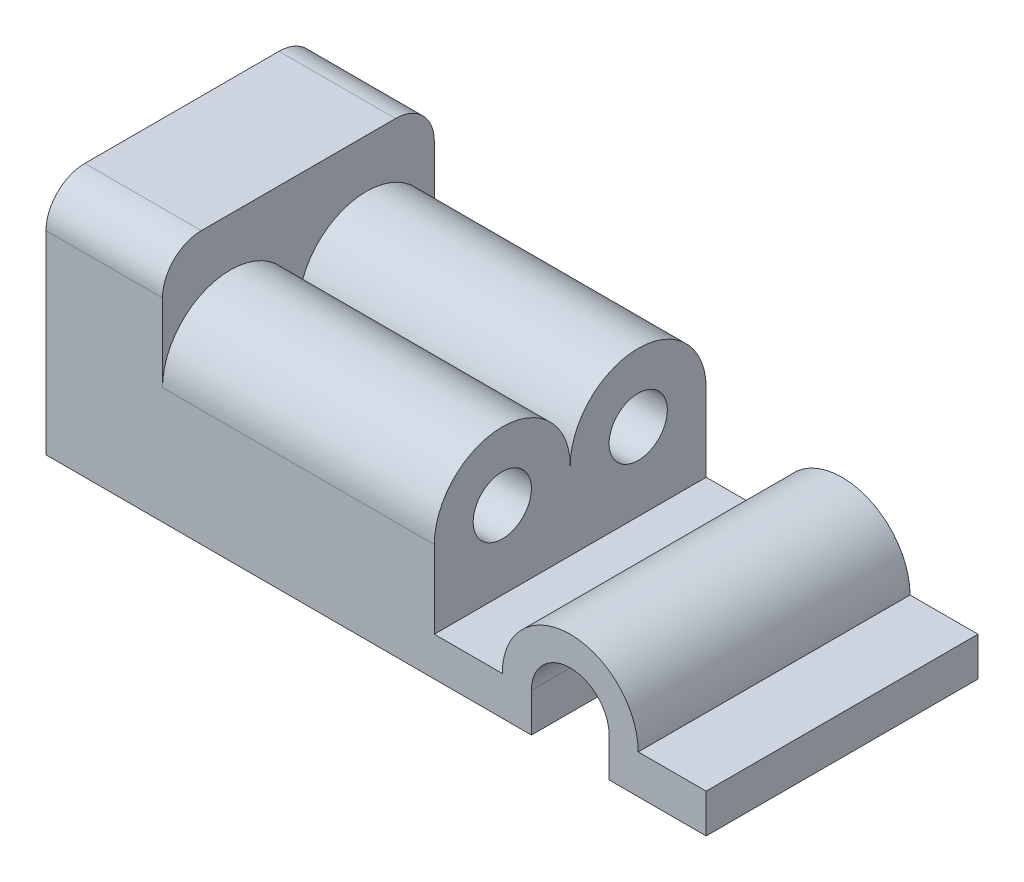
ISO-10303-21;
HEADER;
FILE_DESCRIPTION(('STEP AP214'),'2;1');
FILE_NAME('part.step','',(''),(''),'','','');
FILE_SCHEMA(('AUTOMOTIVE_DESIGN { 1 0 10303 214 1 1 1 1 }'));
ENDSEC;
DATA;
#1=APPLICATION_CONTEXT('core data for automotive mechanical design processes');
#2=APPLICATION_PROTOCOL_DEFINITION('international standard','automotive_design',2000,#1);
#3=PRODUCT_CONTEXT('',#1,'mechanical');
#4=PRODUCT('Part','Part','',(#3));
#5=PRODUCT_RELATED_PRODUCT_CATEGORY('part','',(#4));
#6=PRODUCT_DEFINITION_FORMATION('','',#4);
#7=PRODUCT_DEFINITION_CONTEXT('part definition',#1,'design');
#8=PRODUCT_DEFINITION('design','',#6,#7);
#9=PRODUCT_DEFINITION_SHAPE('','',#8);
#10=(LENGTH_UNIT() NAMED_UNIT(*) SI_UNIT(.MILLI.,.METRE.));
#11=(NAMED_UNIT(*) PLANE_ANGLE_UNIT() SI_UNIT($,.RADIAN.));
#12=(NAMED_UNIT(*) SI_UNIT($,.STERADIAN.) SOLID_ANGLE_UNIT());
#13=UNCERTAINTY_MEASURE_WITH_UNIT(LENGTH_MEASURE(1.E-05),#10,'distance_accuracy_value','');
#14=(GEOMETRIC_REPRESENTATION_CONTEXT(3) GLOBAL_UNCERTAINTY_ASSIGNED_CONTEXT((#13)) GLOBAL_UNIT_ASSIGNED_CONTEXT((#10,
#11,#12)) REPRESENTATION_CONTEXT('',''));
#15=CARTESIAN_POINT('',(0.,0.,0.));
#16=DIRECTION('',(0.,0.,1.));
#17=DIRECTION('',(1.,0.,0.));
#18=AXIS2_PLACEMENT_3D('',#15,#16,#17);
#19=CARTESIAN_POINT('',(60.,-30.,-70.));
#20=DIRECTION('',(0.,-1.,0.));
#21=DIRECTION('',(1.,0.,0.));
#22=AXIS2_PLACEMENT_3D('',#19,#20,#21);
#23=PLANE('',#22);
#24=DIRECTION('',(1.,0.,0.));
#25=VECTOR('',#24,1.);
#26=CARTESIAN_POINT('',(60.,-30.,0.));
#27=LINE('',#26,#25);
#28=CARTESIAN_POINT('',(60.,-30.,0.));
#29=VERTEX_POINT('',#28);
#30=CARTESIAN_POINT('',(85.,-30.,0.));
#31=VERTEX_POINT('',#30);
#32=EDGE_CURVE('E183',#29,#31,#27,.T.);
#33=ORIENTED_EDGE('',*,*,#32,.F.);
#34=DIRECTION('',(0.,0.,1.));
#35=VECTOR('',#34,1.);
#36=CARTESIAN_POINT('',(60.,-30.,-70.));
#37=LINE('',#36,#35);
#38=CARTESIAN_POINT('',(60.,-30.,-70.));
#39=VERTEX_POINT('',#38);
#40=EDGE_CURVE('E294',#39,#29,#37,.T.);
#41=ORIENTED_EDGE('',*,*,#40,.F.);
#42=DIRECTION('',(1.,0.,0.));
#43=VECTOR('',#42,1.);
#44=CARTESIAN_POINT('',(60.,-30.,-70.));
#45=LINE('',#44,#43);
#46=CARTESIAN_POINT('',(85.,-30.,-70.));
#47=VERTEX_POINT('',#46);
#48=EDGE_CURVE('E199',#39,#47,#45,.T.);
#49=ORIENTED_EDGE('',*,*,#48,.T.);
#50=DIRECTION('',(0.,0.,1.));
#51=VECTOR('',#50,1.);
#52=CARTESIAN_POINT('',(85.,-30.,-70.));
#53=LINE('',#52,#51);
#54=EDGE_CURVE('E247',#47,#31,#53,.T.);
#55=ORIENTED_EDGE('',*,*,#54,.T.);
#56=EDGE_LOOP('',(#33,#41,#49,#55));
#57=FACE_BOUND('',#56,.T.);
#58=ADVANCED_FACE('F43',(#57),#23,.T.);
#59=CARTESIAN_POINT('',(60.,-20.,-70.));
#60=DIRECTION('',(-1.,0.,0.));
#61=DIRECTION('',(0.,0.,1.));
#62=AXIS2_PLACEMENT_3D('',#59,#60,#61);
#63=PLANE('',#62);
#64=DIRECTION('',(0.,-1.,0.));
#65=VECTOR('',#64,1.);
#66=CARTESIAN_POINT('',(60.,-20.,0.));
#67=LINE('',#66,#65);
#68=CARTESIAN_POINT('',(60.,-20.,0.));
#69=VERTEX_POINT('',#68);
#70=EDGE_CURVE('E204',#69,#29,#67,.T.);
#71=ORIENTED_EDGE('',*,*,#70,.F.);
#72=DIRECTION('',(0.,0.,1.));
#73=VECTOR('',#72,1.);
#74=CARTESIAN_POINT('',(60.,-20.,-70.));
#75=LINE('',#74,#73);
#76=CARTESIAN_POINT('',(60.,-20.,-70.));
#77=VERTEX_POINT('',#76);
#78=EDGE_CURVE('E298',#77,#69,#75,.T.);
#79=ORIENTED_EDGE('',*,*,#78,.F.);
#80=DIRECTION('',(0.,-1.,0.));
#81=VECTOR('',#80,1.);
#82=CARTESIAN_POINT('',(60.,-20.,-70.));
#83=LINE('',#82,#81);
#84=EDGE_CURVE('E243',#77,#39,#83,.T.);
#85=ORIENTED_EDGE('',*,*,#84,.T.);
#86=ORIENTED_EDGE('',*,*,#40,.T.);
#87=EDGE_LOOP('',(#71,#79,#85,#86));
#88=FACE_BOUND('',#87,.T.);
#89=ADVANCED_FACE('F392',(#88),#63,.T.);
#90=CARTESIAN_POINT('',(50.,-20.,-70.));
#91=DIRECTION('',(0.,0.,1.));
#92=DIRECTION('',(1.,0.,0.));
#93=AXIS2_PLACEMENT_3D('',#90,#91,#92);
#94=CYLINDRICAL_SURFACE('',#93,10.);
#95=CARTESIAN_POINT('',(50.,-20.,0.));
#96=DIRECTION('',(0.,0.,-1.));
#97=DIRECTION('',(1.,0.,0.));
#98=AXIS2_PLACEMENT_3D('',#95,#96,#97);
#99=CIRCLE('',#98,10.);
#100=CARTESIAN_POINT('',(40.,-20.,0.));
#101=VERTEX_POINT('',#100);
#102=EDGE_CURVE('E287',#101,#69,#99,.T.);
#103=ORIENTED_EDGE('',*,*,#102,.F.);
#104=DIRECTION('',(0.,0.,1.));
#105=VECTOR('',#104,1.);
#106=CARTESIAN_POINT('',(40.,-20.,-70.));
#107=LINE('',#106,#105);
#108=CARTESIAN_POINT('',(40.,-20.,-70.));
#109=VERTEX_POINT('',#108);
#110=EDGE_CURVE('E301',#109,#101,#107,.T.);
#111=ORIENTED_EDGE('',*,*,#110,.F.);
#112=CARTESIAN_POINT('',(50.,-20.,-70.));
#113=DIRECTION('',(0.,0.,-1.));
#114=DIRECTION('',(1.,0.,0.));
#115=AXIS2_PLACEMENT_3D('',#112,#113,#114);
#116=CIRCLE('',#115,10.);
#117=EDGE_CURVE('E239',#109,#77,#116,.T.);
#118=ORIENTED_EDGE('',*,*,#117,.T.);
#119=ORIENTED_EDGE('',*,*,#78,.T.);
#120=EDGE_LOOP('',(#103,#111,#118,#119));
#121=FACE_BOUND('',#120,.T.);
#122=ADVANCED_FACE('F416',(#121),#94,.F.);
#123=CARTESIAN_POINT('',(40.,-20.,-70.));
#124=DIRECTION('',(1.,0.,0.));
#125=DIRECTION('',(0.,1.,0.));
#126=AXIS2_PLACEMENT_3D('',#123,#124,#125);
#127=PLANE('',#126);
#128=DIRECTION('',(0.,1.,0.));
#129=VECTOR('',#128,1.);
#130=CARTESIAN_POINT('',(40.,-20.,0.));
#131=LINE('',#130,#129);
#132=CARTESIAN_POINT('',(40.,-30.,0.));
#133=VERTEX_POINT('',#132);
#134=EDGE_CURVE('E283',#133,#101,#131,.T.);
#135=ORIENTED_EDGE('',*,*,#134,.F.);
#136=DIRECTION('',(0.,0.,1.));
#137=VECTOR('',#136,1.);
#138=CARTESIAN_POINT('',(40.,-30.,-70.));
#139=LINE('',#138,#137);
#140=CARTESIAN_POINT('',(40.,-30.,-70.));
#141=VERTEX_POINT('',#140);
#142=EDGE_CURVE('E304',#141,#133,#139,.T.);
#143=ORIENTED_EDGE('',*,*,#142,.F.);
#144=DIRECTION('',(0.,1.,0.));
#145=VECTOR('',#144,1.);
#146=CARTESIAN_POINT('',(40.,-20.,-70.));
#147=LINE('',#146,#145);
#148=EDGE_CURVE('E235',#141,#109,#147,.T.);
#149=ORIENTED_EDGE('',*,*,#148,.T.);
#150=ORIENTED_EDGE('',*,*,#110,.T.);
#151=EDGE_LOOP('',(#135,#143,#149,#150));
#152=FACE_BOUND('',#151,.T.);
#153=ADVANCED_FACE('F399',(#152),#127,.T.);
#154=CARTESIAN_POINT('',(-85.,-30.,-70.));
#155=DIRECTION('',(0.,-1.,0.));
#156=DIRECTION('',(1.,0.,0.));
#157=AXIS2_PLACEMENT_3D('',#154,#155,#156);
#158=PLANE('',#157);
#159=DIRECTION('',(1.,0.,0.));
#160=VECTOR('',#159,1.);
#161=CARTESIAN_POINT('',(-85.,-30.,0.));
#162=LINE('',#161,#160);
#163=CARTESIAN_POINT('',(-85.,-30.,0.));
#164=VERTEX_POINT('',#163);
#165=EDGE_CURVE('E279',#164,#133,#162,.T.);
#166=ORIENTED_EDGE('',*,*,#165,.F.);
#167=DIRECTION('',(0.,0.,1.));
#168=VECTOR('',#167,1.);
#169=CARTESIAN_POINT('',(-85.,-30.,-70.));
#170=LINE('',#169,#168);
#171=CARTESIAN_POINT('',(-85.,-30.,-70.));
#172=VERTEX_POINT('',#171);
#173=EDGE_CURVE('E307',#172,#164,#170,.T.);
#174=ORIENTED_EDGE('',*,*,#173,.F.);
#175=DIRECTION('',(1.,0.,0.));
#176=VECTOR('',#175,1.);
#177=CARTESIAN_POINT('',(-85.,-30.,-70.));
#178=LINE('',#177,#176);
#179=EDGE_CURVE('E231',#172,#141,#178,.T.);
#180=ORIENTED_EDGE('',*,*,#179,.T.);
#181=ORIENTED_EDGE('',*,*,#142,.T.);
#182=EDGE_LOOP('',(#166,#174,#180,#181));
#183=FACE_BOUND('',#182,.T.);
#184=ADVANCED_FACE('F403',(#183),#158,.T.);
#185=CARTESIAN_POINT('',(-85.,30.,-70.));
#186=DIRECTION('',(-1.,0.,0.));
#187=DIRECTION('',(0.,0.,1.));
#188=AXIS2_PLACEMENT_3D('',#185,#186,#187);
#189=PLANE('',#188);
#190=CARTESIAN_POINT('',(-85.,0.,-17.5));
#191=DIRECTION('',(-1.,0.,0.));
#192=DIRECTION('',(0.,0.,1.));
#193=AXIS2_PLACEMENT_3D('',#190,#191,#192);
#194=CIRCLE('',#193,7.5);
#195=CARTESIAN_POINT('',(-85.,7.49999999999999,-17.5));
#196=VERTEX_POINT('',#195);
#197=EDGE_CURVE('E192',#196,#196,#194,.T.);
#198=ORIENTED_EDGE('',*,*,#197,.F.);
#199=EDGE_LOOP('',(#198));
#200=FACE_BOUND('',#199,.T.);
#201=CARTESIAN_POINT('',(-85.,0.,-52.5));
#202=DIRECTION('',(-1.,0.,0.));
#203=DIRECTION('',(0.,0.,1.));
#204=AXIS2_PLACEMENT_3D('',#201,#202,#203);
#205=CIRCLE('',#204,7.5);
#206=CARTESIAN_POINT('',(-85.,7.49999999999999,-52.5));
#207=VERTEX_POINT('',#206);
#208=EDGE_CURVE('E465',#207,#207,#205,.T.);
#209=ORIENTED_EDGE('',*,*,#208,.F.);
#210=EDGE_LOOP('',(#209));
#211=FACE_BOUND('',#210,.T.);
#212=DIRECTION('',(0.,0.,1.));
#213=VECTOR('',#212,1.);
#214=CARTESIAN_POINT('',(-85.,30.,-70.));
#215=LINE('',#214,#213);
#216=CARTESIAN_POINT('',(-85.,30.,-60.));
#217=VERTEX_POINT('',#216);
#218=CARTESIAN_POINT('',(-85.,30.,-10.));
#219=VERTEX_POINT('',#218);
#220=EDGE_CURVE('E311',#217,#219,#215,.T.);
#221=ORIENTED_EDGE('',*,*,#220,.F.);
#222=CARTESIAN_POINT('',(-85.,20.,-60.));
#223=DIRECTION('',(-1.,0.,0.));
#224=DIRECTION('',(0.,0.,1.));
#225=AXIS2_PLACEMENT_3D('',#222,#223,#224);
#226=CIRCLE('',#225,10.);
#227=CARTESIAN_POINT('',(-85.,20.,-70.));
#228=VERTEX_POINT('',#227);
#229=EDGE_CURVE('E66',#217,#228,#226,.T.);
#230=ORIENTED_EDGE('',*,*,#229,.T.);
#231=DIRECTION('',(0.,-1.,0.));
#232=VECTOR('',#231,1.);
#233=CARTESIAN_POINT('',(-85.,30.,-70.));
#234=LINE('',#233,#232);
#235=EDGE_CURVE('E228',#228,#172,#234,.T.);
#236=ORIENTED_EDGE('',*,*,#235,.T.);
#237=ORIENTED_EDGE('',*,*,#173,.T.);
#238=DIRECTION('',(0.,-1.,0.));
#239=VECTOR('',#238,1.);
#240=CARTESIAN_POINT('',(-85.,30.,0.));
#241=LINE('',#240,#239);
#242=CARTESIAN_POINT('',(-85.,20.,0.));
#243=VERTEX_POINT('',#242);
#244=EDGE_CURVE('E276',#243,#164,#241,.T.);
#245=ORIENTED_EDGE('',*,*,#244,.F.);
#246=CARTESIAN_POINT('',(-85.,20.,-10.));
#247=DIRECTION('',(-1.,0.,0.));
#248=DIRECTION('',(0.,0.,1.));
#249=AXIS2_PLACEMENT_3D('',#246,#247,#248);
#250=CIRCLE('',#249,10.);
#251=EDGE_CURVE('E334',#243,#219,#250,.T.);
#252=ORIENTED_EDGE('',*,*,#251,.T.);
#253=EDGE_LOOP('',(#221,#230,#236,#237,#245,#252));
#254=FACE_BOUND('',#253,.T.);
#255=ADVANCED_FACE('F357',(#200,#211,#254),#189,.T.);
#256=CARTESIAN_POINT('',(-85.,30.,-70.));
#257=DIRECTION('',(0.,1.,0.));
#258=DIRECTION('',(0.,0.,1.));
#259=AXIS2_PLACEMENT_3D('',#256,#257,#258);
#260=PLANE('',#259);
#261=DIRECTION('',(0.,0.,1.));
#262=VECTOR('',#261,1.);
#263=CARTESIAN_POINT('',(-55.,30.,-70.));
#264=LINE('',#263,#262);
#265=CARTESIAN_POINT('',(-55.,30.,-60.));
#266=VERTEX_POINT('',#265);
#267=CARTESIAN_POINT('',(-55.,30.,-10.));
#268=VERTEX_POINT('',#267);
#269=EDGE_CURVE('E314',#266,#268,#264,.T.);
#270=ORIENTED_EDGE('',*,*,#269,.F.);
#271=DIRECTION('',(-1.,0.,0.));
#272=VECTOR('',#271,1.);
#273=CARTESIAN_POINT('',(-85.,30.,-60.));
#274=LINE('',#273,#272);
#275=EDGE_CURVE('E345',#266,#217,#274,.T.);
#276=ORIENTED_EDGE('',*,*,#275,.T.);
#277=ORIENTED_EDGE('',*,*,#220,.T.);
#278=DIRECTION('',(-1.,0.,0.));
#279=VECTOR('',#278,1.);
#280=CARTESIAN_POINT('',(-85.,30.,-10.));
#281=LINE('',#280,#279);
#282=EDGE_CURVE('E338',#219,#268,#281,.F.);
#283=ORIENTED_EDGE('',*,*,#282,.T.);
#284=EDGE_LOOP('',(#270,#276,#277,#283));
#285=FACE_BOUND('',#284,.T.);
#286=ADVANCED_FACE('F354',(#285),#260,.T.);
#287=CARTESIAN_POINT('',(-55.,30.,-70.));
#288=DIRECTION('',(1.,0.,0.));
#289=DIRECTION('',(0.,0.,-1.));
#290=AXIS2_PLACEMENT_3D('',#287,#288,#289);
#291=PLANE('',#290);
#292=CARTESIAN_POINT('',(-55.,0.,-52.5));
#293=DIRECTION('',(1.,0.,0.));
#294=DIRECTION('',(0.,1.,0.));
#295=AXIS2_PLACEMENT_3D('',#292,#293,#294);
#296=CIRCLE('',#295,17.5);
#297=CARTESIAN_POINT('',(-55.,0.,-70.));
#298=VERTEX_POINT('',#297);
#299=CARTESIAN_POINT('',(-55.,0.,-35.));
#300=VERTEX_POINT('',#299);
#301=EDGE_CURVE('E181',#298,#300,#296,.T.);
#302=ORIENTED_EDGE('',*,*,#301,.F.);
#303=DIRECTION('',(0.,1.,0.));
#304=VECTOR('',#303,1.);
#305=CARTESIAN_POINT('',(-55.,30.,-70.));
#306=LINE('',#305,#304);
#307=CARTESIAN_POINT('',(-55.,20.,-70.));
#308=VERTEX_POINT('',#307);
#309=EDGE_CURVE('E225',#298,#308,#306,.T.);
#310=ORIENTED_EDGE('',*,*,#309,.T.);
#311=CARTESIAN_POINT('',(-55.,20.,-60.));
#312=DIRECTION('',(1.,0.,0.));
#313=DIRECTION('',(0.,0.,-1.));
#314=AXIS2_PLACEMENT_3D('',#311,#312,#313);
#315=CIRCLE('',#314,10.);
#316=EDGE_CURVE('E11',#308,#266,#315,.T.);
#317=ORIENTED_EDGE('',*,*,#316,.T.);
#318=ORIENTED_EDGE('',*,*,#269,.T.);
#319=CARTESIAN_POINT('',(-55.,20.,-10.));
#320=DIRECTION('',(1.,0.,0.));
#321=DIRECTION('',(0.,0.,-1.));
#322=AXIS2_PLACEMENT_3D('',#319,#320,#321);
#323=CIRCLE('',#322,10.);
#324=CARTESIAN_POINT('',(-55.,20.,0.));
#325=VERTEX_POINT('',#324);
#326=EDGE_CURVE('E342',#268,#325,#323,.T.);
#327=ORIENTED_EDGE('',*,*,#326,.T.);
#328=DIRECTION('',(0.,1.,0.));
#329=VECTOR('',#328,1.);
#330=CARTESIAN_POINT('',(-55.,30.,0.));
#331=LINE('',#330,#329);
#332=CARTESIAN_POINT('',(-55.,0.,0.));
#333=VERTEX_POINT('',#332);
#334=EDGE_CURVE('E272',#333,#325,#331,.T.);
#335=ORIENTED_EDGE('',*,*,#334,.F.);
#336=CARTESIAN_POINT('',(-55.,0.,-17.5));
#337=DIRECTION('',(1.,0.,0.));
#338=DIRECTION('',(0.,1.,0.));
#339=AXIS2_PLACEMENT_3D('',#336,#337,#338);
#340=CIRCLE('',#339,17.5);
#341=EDGE_CURVE('E173',#300,#333,#340,.T.);
#342=ORIENTED_EDGE('',*,*,#341,.F.);
#343=EDGE_LOOP('',(#302,#310,#317,#318,#327,#335,#342));
#344=FACE_BOUND('',#343,.T.);
#345=ADVANCED_FACE('F366',(#344),#291,.T.);
#346=CARTESIAN_POINT('',(15.,0.,-70.));
#347=DIRECTION('',(1.,0.,0.));
#348=DIRECTION('',(0.,1.,0.));
#349=AXIS2_PLACEMENT_3D('',#346,#347,#348);
#350=PLANE('',#349);
#351=CARTESIAN_POINT('',(15.,0.,-17.5));
#352=DIRECTION('',(1.,0.,0.));
#353=DIRECTION('',(0.,1.,0.));
#354=AXIS2_PLACEMENT_3D('',#351,#352,#353);
#355=CIRCLE('',#354,7.5);
#356=CARTESIAN_POINT('',(15.,7.5,-17.5));
#357=VERTEX_POINT('',#356);
#358=EDGE_CURVE('E463',#357,#357,#355,.T.);
#359=ORIENTED_EDGE('',*,*,#358,.F.);
#360=EDGE_LOOP('',(#359));
#361=FACE_BOUND('',#360,.T.);
#362=CARTESIAN_POINT('',(15.,0.,-52.5));
#363=DIRECTION('',(1.,0.,0.));
#364=DIRECTION('',(0.,1.,0.));
#365=AXIS2_PLACEMENT_3D('',#362,#363,#364);
#366=CIRCLE('',#365,7.5);
#367=CARTESIAN_POINT('',(15.,7.5,-52.5));
#368=VERTEX_POINT('',#367);
#369=EDGE_CURVE('E466',#368,#368,#366,.T.);
#370=ORIENTED_EDGE('',*,*,#369,.F.);
#371=EDGE_LOOP('',(#370));
#372=FACE_BOUND('',#371,.T.);
#373=DIRECTION('',(0.,1.,0.));
#374=VECTOR('',#373,1.);
#375=CARTESIAN_POINT('',(15.,0.,0.));
#376=LINE('',#375,#374);
#377=CARTESIAN_POINT('',(15.,-20.,0.));
#378=VERTEX_POINT('',#377);
#379=CARTESIAN_POINT('',(15.,0.,0.));
#380=VERTEX_POINT('',#379);
#381=EDGE_CURVE('E267',#378,#380,#376,.T.);
#382=ORIENTED_EDGE('',*,*,#381,.F.);
#383=DIRECTION('',(0.,0.,1.));
#384=VECTOR('',#383,1.);
#385=CARTESIAN_POINT('',(15.,-20.,-70.));
#386=LINE('',#385,#384);
#387=CARTESIAN_POINT('',(15.,-20.,-70.));
#388=VERTEX_POINT('',#387);
#389=EDGE_CURVE('E317',#388,#378,#386,.T.);
#390=ORIENTED_EDGE('',*,*,#389,.F.);
#391=DIRECTION('',(0.,1.,0.));
#392=VECTOR('',#391,1.);
#393=CARTESIAN_POINT('',(15.,0.,-70.));
#394=LINE('',#393,#392);
#395=CARTESIAN_POINT('',(15.,0.,-70.));
#396=VERTEX_POINT('',#395);
#397=EDGE_CURVE('E188',#388,#396,#394,.T.);
#398=ORIENTED_EDGE('',*,*,#397,.T.);
#399=CARTESIAN_POINT('',(15.,0.,-52.5));
#400=DIRECTION('',(1.,0.,0.));
#401=DIRECTION('',(0.,1.,0.));
#402=AXIS2_PLACEMENT_3D('',#399,#400,#401);
#403=CIRCLE('',#402,17.5);
#404=CARTESIAN_POINT('',(15.,0.,-35.));
#405=VERTEX_POINT('',#404);
#406=EDGE_CURVE('E174',#396,#405,#403,.T.);
#407=ORIENTED_EDGE('',*,*,#406,.T.);
#408=CARTESIAN_POINT('',(15.,0.,-17.5));
#409=DIRECTION('',(1.,0.,0.));
#410=DIRECTION('',(0.,1.,0.));
#411=AXIS2_PLACEMENT_3D('',#408,#409,#410);
#412=CIRCLE('',#411,17.5);
#413=EDGE_CURVE('E161',#405,#380,#412,.T.);
#414=ORIENTED_EDGE('',*,*,#413,.T.);
#415=EDGE_LOOP('',(#382,#390,#398,#407,#414));
#416=FACE_BOUND('',#415,.T.);
#417=ADVANCED_FACE('F186',(#361,#372,#416),#350,.T.);
#418=CARTESIAN_POINT('',(15.,-20.,-70.));
#419=DIRECTION('',(0.,1.,0.));
#420=DIRECTION('',(0.,0.,1.));
#421=AXIS2_PLACEMENT_3D('',#418,#419,#420);
#422=PLANE('',#421);
#423=DIRECTION('',(-1.,0.,0.));
#424=VECTOR('',#423,1.);
#425=CARTESIAN_POINT('',(15.,-20.,0.));
#426=LINE('',#425,#424);
#427=CARTESIAN_POINT('',(32.5,-20.,0.));
#428=VERTEX_POINT('',#427);
#429=EDGE_CURVE('E263',#428,#378,#426,.T.);
#430=ORIENTED_EDGE('',*,*,#429,.F.);
#431=DIRECTION('',(0.,0.,1.));
#432=VECTOR('',#431,1.);
#433=CARTESIAN_POINT('',(32.5,-20.,-70.));
#434=LINE('',#433,#432);
#435=CARTESIAN_POINT('',(32.5,-20.,-70.));
#436=VERTEX_POINT('',#435);
#437=EDGE_CURVE('E320',#436,#428,#434,.T.);
#438=ORIENTED_EDGE('',*,*,#437,.F.);
#439=DIRECTION('',(-1.,0.,0.));
#440=VECTOR('',#439,1.);
#441=CARTESIAN_POINT('',(15.,-20.,-70.));
#442=LINE('',#441,#440);
#443=EDGE_CURVE('E216',#436,#388,#442,.T.);
#444=ORIENTED_EDGE('',*,*,#443,.T.);
#445=ORIENTED_EDGE('',*,*,#389,.T.);
#446=EDGE_LOOP('',(#430,#438,#444,#445));
#447=FACE_BOUND('',#446,.T.);
#448=ADVANCED_FACE('F374',(#447),#422,.T.);
#449=CARTESIAN_POINT('',(50.,-20.,-70.));
#450=DIRECTION('',(0.,0.,1.));
#451=DIRECTION('',(1.,0.,0.));
#452=AXIS2_PLACEMENT_3D('',#449,#450,#451);
#453=CYLINDRICAL_SURFACE('',#452,17.5);
#454=CARTESIAN_POINT('',(50.,-20.,0.));
#455=DIRECTION('',(0.,0.,1.));
#456=DIRECTION('',(1.,0.,0.));
#457=AXIS2_PLACEMENT_3D('',#454,#455,#456);
#458=CIRCLE('',#457,17.5);
#459=CARTESIAN_POINT('',(67.5,-20.,0.));
#460=VERTEX_POINT('',#459);
#461=EDGE_CURVE('E259',#460,#428,#458,.T.);
#462=ORIENTED_EDGE('',*,*,#461,.F.);
#463=DIRECTION('',(0.,0.,1.));
#464=VECTOR('',#463,1.);
#465=CARTESIAN_POINT('',(67.5,-20.,-70.));
#466=LINE('',#465,#464);
#467=CARTESIAN_POINT('',(67.5,-20.,-70.));
#468=VERTEX_POINT('',#467);
#469=EDGE_CURVE('E323',#468,#460,#466,.T.);
#470=ORIENTED_EDGE('',*,*,#469,.F.);
#471=CARTESIAN_POINT('',(50.,-20.,-70.));
#472=DIRECTION('',(0.,0.,1.));
#473=DIRECTION('',(1.,0.,0.));
#474=AXIS2_PLACEMENT_3D('',#471,#472,#473);
#475=CIRCLE('',#474,17.5);
#476=EDGE_CURVE('E212',#468,#436,#475,.T.);
#477=ORIENTED_EDGE('',*,*,#476,.T.);
#478=ORIENTED_EDGE('',*,*,#437,.T.);
#479=EDGE_LOOP('',(#462,#470,#477,#478));
#480=FACE_BOUND('',#479,.T.);
#481=ADVANCED_FACE('F377',(#480),#453,.T.);
#482=CARTESIAN_POINT('',(67.5,-20.,-70.));
#483=DIRECTION('',(0.,1.,0.));
#484=DIRECTION('',(0.,0.,1.));
#485=AXIS2_PLACEMENT_3D('',#482,#483,#484);
#486=PLANE('',#485);
#487=DIRECTION('',(-1.,0.,0.));
#488=VECTOR('',#487,1.);
#489=CARTESIAN_POINT('',(67.5,-20.,0.));
#490=LINE('',#489,#488);
#491=CARTESIAN_POINT('',(85.,-20.,0.));
#492=VERTEX_POINT('',#491);
#493=EDGE_CURVE('E255',#492,#460,#490,.T.);
#494=ORIENTED_EDGE('',*,*,#493,.F.);
#495=DIRECTION('',(0.,0.,1.));
#496=VECTOR('',#495,1.);
#497=CARTESIAN_POINT('',(85.,-20.,-70.));
#498=LINE('',#497,#496);
#499=CARTESIAN_POINT('',(85.,-20.,-70.));
#500=VERTEX_POINT('',#499);
#501=EDGE_CURVE('E326',#500,#492,#498,.T.);
#502=ORIENTED_EDGE('',*,*,#501,.F.);
#503=DIRECTION('',(-1.,0.,0.));
#504=VECTOR('',#503,1.);
#505=CARTESIAN_POINT('',(67.5,-20.,-70.));
#506=LINE('',#505,#504);
#507=EDGE_CURVE('E208',#500,#468,#506,.T.);
#508=ORIENTED_EDGE('',*,*,#507,.T.);
#509=ORIENTED_EDGE('',*,*,#469,.T.);
#510=EDGE_LOOP('',(#494,#502,#508,#509));
#511=FACE_BOUND('',#510,.T.);
#512=ADVANCED_FACE('F382',(#511),#486,.T.);
#513=CARTESIAN_POINT('',(85.,-20.,-70.));
#514=DIRECTION('',(1.,0.,0.));
#515=DIRECTION('',(0.,0.,-1.));
#516=AXIS2_PLACEMENT_3D('',#513,#514,#515);
#517=PLANE('',#516);
#518=DIRECTION('',(0.,1.,0.));
#519=VECTOR('',#518,1.);
#520=CARTESIAN_POINT('',(85.,-20.,0.));
#521=LINE('',#520,#519);
#522=EDGE_CURVE('E251',#31,#492,#521,.T.);
#523=ORIENTED_EDGE('',*,*,#522,.F.);
#524=ORIENTED_EDGE('',*,*,#54,.F.);
#525=DIRECTION('',(0.,1.,0.));
#526=VECTOR('',#525,1.);
#527=CARTESIAN_POINT('',(85.,-20.,-70.));
#528=LINE('',#527,#526);
#529=EDGE_CURVE('E203',#47,#500,#528,.T.);
#530=ORIENTED_EDGE('',*,*,#529,.T.);
#531=ORIENTED_EDGE('',*,*,#501,.T.);
#532=EDGE_LOOP('',(#523,#524,#530,#531));
#533=FACE_BOUND('',#532,.T.);
#534=ADVANCED_FACE('F385',(#533),#517,.T.);
#535=CARTESIAN_POINT('',(50.,-20.,-70.));
#536=DIRECTION('',(0.,0.,1.));
#537=DIRECTION('',(1.,0.,0.));
#538=AXIS2_PLACEMENT_3D('',#535,#536,#537);
#539=PLANE('',#538);
#540=ORIENTED_EDGE('',*,*,#235,.F.);
#541=DIRECTION('',(-1.,0.,0.));
#542=VECTOR('',#541,1.);
#543=CARTESIAN_POINT('',(-55.,20.,-70.));
#544=LINE('',#543,#542);
#545=EDGE_CURVE('E52',#228,#308,#544,.F.);
#546=ORIENTED_EDGE('',*,*,#545,.T.);
#547=ORIENTED_EDGE('',*,*,#309,.F.);
#548=DIRECTION('',(-1.,0.,0.));
#549=VECTOR('',#548,1.);
#550=CARTESIAN_POINT('',(-55.,0.,-70.));
#551=LINE('',#550,#549);
#552=EDGE_CURVE('E222',#396,#298,#551,.T.);
#553=ORIENTED_EDGE('',*,*,#552,.F.);
#554=ORIENTED_EDGE('',*,*,#397,.F.);
#555=ORIENTED_EDGE('',*,*,#443,.F.);
#556=ORIENTED_EDGE('',*,*,#476,.F.);
#557=ORIENTED_EDGE('',*,*,#507,.F.);
#558=ORIENTED_EDGE('',*,*,#529,.F.);
#559=ORIENTED_EDGE('',*,*,#48,.F.);
#560=ORIENTED_EDGE('',*,*,#84,.F.);
#561=ORIENTED_EDGE('',*,*,#117,.F.);
#562=ORIENTED_EDGE('',*,*,#148,.F.);
#563=ORIENTED_EDGE('',*,*,#179,.F.);
#564=EDGE_LOOP('',(#540,#546,#547,#553,#554,#555,#556,#557,#558,#559,#560,#561,#562,#563));
#565=FACE_BOUND('',#564,.T.);
#566=ADVANCED_FACE('F372',(#565),#539,.F.);
#567=CARTESIAN_POINT('',(50.,-20.,0.));
#568=DIRECTION('',(0.,0.,1.));
#569=DIRECTION('',(1.,0.,0.));
#570=AXIS2_PLACEMENT_3D('',#567,#568,#569);
#571=PLANE('',#570);
#572=ORIENTED_EDGE('',*,*,#334,.T.);
#573=DIRECTION('',(-1.,0.,0.));
#574=VECTOR('',#573,1.);
#575=CARTESIAN_POINT('',(50.,20.,0.));
#576=LINE('',#575,#574);
#577=EDGE_CURVE('E297',#325,#243,#576,.T.);
#578=ORIENTED_EDGE('',*,*,#577,.T.);
#579=ORIENTED_EDGE('',*,*,#244,.T.);
#580=ORIENTED_EDGE('',*,*,#165,.T.);
#581=ORIENTED_EDGE('',*,*,#134,.T.);
#582=ORIENTED_EDGE('',*,*,#102,.T.);
#583=ORIENTED_EDGE('',*,*,#70,.T.);
#584=ORIENTED_EDGE('',*,*,#32,.T.);
#585=ORIENTED_EDGE('',*,*,#522,.T.);
#586=ORIENTED_EDGE('',*,*,#493,.T.);
#587=ORIENTED_EDGE('',*,*,#461,.T.);
#588=ORIENTED_EDGE('',*,*,#429,.T.);
#589=ORIENTED_EDGE('',*,*,#381,.T.);
#590=DIRECTION('',(-1.,0.,0.));
#591=VECTOR('',#590,1.);
#592=CARTESIAN_POINT('',(-55.,0.,0.));
#593=LINE('',#592,#591);
#594=EDGE_CURVE('E167',#380,#333,#593,.T.);
#595=ORIENTED_EDGE('',*,*,#594,.T.);
#596=EDGE_LOOP('',(#572,#578,#579,#580,#581,#582,#583,#584,#585,#586,#587,#588,#589,#595));
#597=FACE_BOUND('',#596,.T.);
#598=ADVANCED_FACE('F368',(#597),#571,.T.);
#599=CARTESIAN_POINT('',(50.,20.,-10.));
#600=DIRECTION('',(-1.,0.,0.));
#601=DIRECTION('',(0.,0.,1.));
#602=AXIS2_PLACEMENT_3D('',#599,#600,#601);
#603=CYLINDRICAL_SURFACE('',#602,10.);
#604=ORIENTED_EDGE('',*,*,#326,.F.);
#605=ORIENTED_EDGE('',*,*,#282,.F.);
#606=ORIENTED_EDGE('',*,*,#251,.F.);
#607=ORIENTED_EDGE('',*,*,#577,.F.);
#608=EDGE_LOOP('',(#604,#605,#606,#607));
#609=FACE_BOUND('',#608,.T.);
#610=ADVANCED_FACE('F363',(#609),#603,.T.);
#611=CARTESIAN_POINT('',(-85.,20.,-60.));
#612=DIRECTION('',(1.,0.,0.));
#613=DIRECTION('',(0.,0.,-1.));
#614=AXIS2_PLACEMENT_3D('',#611,#612,#613);
#615=CYLINDRICAL_SURFACE('',#614,10.);
#616=ORIENTED_EDGE('',*,*,#316,.F.);
#617=ORIENTED_EDGE('',*,*,#545,.F.);
#618=ORIENTED_EDGE('',*,*,#229,.F.);
#619=ORIENTED_EDGE('',*,*,#275,.F.);
#620=EDGE_LOOP('',(#616,#617,#618,#619));
#621=FACE_BOUND('',#620,.T.);
#622=ADVANCED_FACE('F45',(#621),#615,.T.);
#623=CARTESIAN_POINT('',(-55.,0.,-17.5));
#624=DIRECTION('',(1.,0.,0.));
#625=DIRECTION('',(0.,1.,0.));
#626=AXIS2_PLACEMENT_3D('',#623,#624,#625);
#627=CYLINDRICAL_SURFACE('',#626,17.5);
#628=ORIENTED_EDGE('',*,*,#413,.F.);
#629=DIRECTION('',(1.,0.,0.));
#630=VECTOR('',#629,1.);
#631=CARTESIAN_POINT('',(-55.,0.,-35.));
#632=LINE('',#631,#630);
#633=EDGE_CURVE('E164',#300,#405,#632,.T.);
#634=ORIENTED_EDGE('',*,*,#633,.F.);
#635=ORIENTED_EDGE('',*,*,#341,.T.);
#636=ORIENTED_EDGE('',*,*,#594,.F.);
#637=EDGE_LOOP('',(#628,#634,#635,#636));
#638=FACE_BOUND('',#637,.T.);
#639=ADVANCED_FACE('F163',(#638),#627,.T.);
#640=CARTESIAN_POINT('',(-55.,0.,-52.5));
#641=DIRECTION('',(1.,0.,0.));
#642=DIRECTION('',(0.,1.,0.));
#643=AXIS2_PLACEMENT_3D('',#640,#641,#642);
#644=CYLINDRICAL_SURFACE('',#643,17.5);
#645=ORIENTED_EDGE('',*,*,#406,.F.);
#646=ORIENTED_EDGE('',*,*,#552,.T.);
#647=ORIENTED_EDGE('',*,*,#301,.T.);
#648=ORIENTED_EDGE('',*,*,#633,.T.);
#649=EDGE_LOOP('',(#645,#646,#647,#648));
#650=FACE_BOUND('',#649,.T.);
#651=ADVANCED_FACE('F179',(#650),#644,.T.);
#652=CARTESIAN_POINT('',(-170.,0.,-52.5));
#653=DIRECTION('',(1.,0.,0.));
#654=DIRECTION('',(0.,1.,0.));
#655=AXIS2_PLACEMENT_3D('',#652,#653,#654);
#656=CYLINDRICAL_SURFACE('',#655,7.5);
#657=CARTESIAN_POINT('',(-85.,7.49999999999999,-52.5));
#658=CARTESIAN_POINT('',(-83.9583333333333,7.49999999999999,-52.5));
#659=CARTESIAN_POINT('',(-82.9166666666667,7.49999999999999,-52.5));
#660=CARTESIAN_POINT('',(-80.8333333333333,7.49999999999999,-52.5));
#661=CARTESIAN_POINT('',(-79.7916666666667,7.49999999999999,-52.5));
#662=CARTESIAN_POINT('',(-77.7083333333333,7.49999999999999,-52.5));
#663=CARTESIAN_POINT('',(-76.6666666666667,7.49999999999999,-52.5));
#664=CARTESIAN_POINT('',(-74.5833333333333,7.49999999999999,-52.5));
#665=CARTESIAN_POINT('',(-73.5416666666667,7.49999999999999,-52.5));
#666=CARTESIAN_POINT('',(-71.4583333333333,7.49999999999999,-52.5));
#667=CARTESIAN_POINT('',(-70.4166666666667,7.49999999999999,-52.5));
#668=CARTESIAN_POINT('',(-68.3333333333333,7.49999999999999,-52.5));
#669=CARTESIAN_POINT('',(-67.2916666666667,7.49999999999999,-52.5));
#670=CARTESIAN_POINT('',(-65.2083333333333,7.49999999999999,-52.5));
#671=CARTESIAN_POINT('',(-64.1666666666667,7.49999999999999,-52.5));
#672=CARTESIAN_POINT('',(-62.0833333333333,7.49999999999999,-52.5));
#673=CARTESIAN_POINT('',(-61.0416666666667,7.49999999999999,-52.5));
#674=CARTESIAN_POINT('',(-58.9583333333333,7.49999999999999,-52.5));
#675=CARTESIAN_POINT('',(-57.9166666666667,7.49999999999999,-52.5));
#676=CARTESIAN_POINT('',(-55.8333333333333,7.49999999999999,-52.5));
#677=CARTESIAN_POINT('',(-54.7916666666667,7.5,-52.5));
#678=CARTESIAN_POINT('',(-52.7083333333333,7.5,-52.5));
#679=CARTESIAN_POINT('',(-51.6666666666667,7.5,-52.5));
#680=CARTESIAN_POINT('',(-49.5833333333333,7.5,-52.5));
#681=CARTESIAN_POINT('',(-48.5416666666667,7.5,-52.5));
#682=CARTESIAN_POINT('',(-46.4583333333333,7.5,-52.5));
#683=CARTESIAN_POINT('',(-45.4166666666667,7.5,-52.5));
#684=CARTESIAN_POINT('',(-43.3333333333334,7.5,-52.5));
#685=CARTESIAN_POINT('',(-42.2916666666667,7.5,-52.5));
#686=CARTESIAN_POINT('',(-40.2083333333333,7.5,-52.5));
#687=CARTESIAN_POINT('',(-39.1666666666667,7.5,-52.5));
#688=CARTESIAN_POINT('',(-37.0833333333333,7.5,-52.5));
#689=CARTESIAN_POINT('',(-36.0416666666667,7.5,-52.5));
#690=CARTESIAN_POINT('',(-33.9583333333333,7.5,-52.5));
#691=CARTESIAN_POINT('',(-32.9166666666667,7.5,-52.5));
#692=CARTESIAN_POINT('',(-30.8333333333333,7.5,-52.5));
#693=CARTESIAN_POINT('',(-29.7916666666667,7.5,-52.5));
#694=CARTESIAN_POINT('',(-27.7083333333334,7.5,-52.5));
#695=CARTESIAN_POINT('',(-26.6666666666667,7.5,-52.5));
#696=CARTESIAN_POINT('',(-24.5833333333333,7.5,-52.5));
#697=CARTESIAN_POINT('',(-23.5416666666667,7.5,-52.5));
#698=CARTESIAN_POINT('',(-21.4583333333333,7.5,-52.5));
#699=CARTESIAN_POINT('',(-20.4166666666667,7.5,-52.5));
#700=CARTESIAN_POINT('',(-18.3333333333333,7.5,-52.5));
#701=CARTESIAN_POINT('',(-17.2916666666667,7.5,-52.5));
#702=CARTESIAN_POINT('',(-15.2083333333334,7.5,-52.5));
#703=CARTESIAN_POINT('',(-14.1666666666667,7.5,-52.5));
#704=CARTESIAN_POINT('',(-12.0833333333334,7.5,-52.5));
#705=CARTESIAN_POINT('',(-11.0416666666667,7.5,-52.5));
#706=CARTESIAN_POINT('',(-8.95833333333335,7.5,-52.5));
#707=CARTESIAN_POINT('',(-7.91666666666668,7.5,-52.5));
#708=CARTESIAN_POINT('',(-5.83333333333335,7.5,-52.5));
#709=CARTESIAN_POINT('',(-4.79166666666668,7.5,-52.5));
#710=CARTESIAN_POINT('',(-2.70833333333334,7.5,-52.5));
#711=CARTESIAN_POINT('',(-1.66666666666668,7.5,-52.5));
#712=CARTESIAN_POINT('',(0.416666666666649,7.5,-52.5));
#713=CARTESIAN_POINT('',(1.45833333333331,7.5,-52.5));
#714=CARTESIAN_POINT('',(3.54166666666665,7.5,-52.5));
#715=CARTESIAN_POINT('',(4.58333333333332,7.5,-52.5));
#716=CARTESIAN_POINT('',(6.66666666666665,7.5,-52.5));
#717=CARTESIAN_POINT('',(7.70833333333332,7.5,-52.5));
#718=CARTESIAN_POINT('',(9.79166666666665,7.5,-52.5));
#719=CARTESIAN_POINT('',(10.8333333333333,7.5,-52.5));
#720=CARTESIAN_POINT('',(12.9166666666667,7.5,-52.5));
#721=CARTESIAN_POINT('',(13.9583333333333,7.5,-52.5));
#722=CARTESIAN_POINT('',(15.,7.5,-52.5));
#723=B_SPLINE_CURVE_WITH_KNOTS('',3,(#657,#658,#659,#660,#661,#662,#663,#664,#665,#666,#667,
#668,#669,#670,#671,#672,#673,#674,#675,#676,#677,#678,#679,#680,#681,#682,#683,#684,#685,#686,
#687,#688,#689,#690,#691,#692,#693,#694,#695,#696,#697,#698,#699,#700,#701,#702,#703,#704,#705,
#706,#707,#708,#709,#710,#711,#712,#713,#714,#715,#716,#717,#718,#719,#720,#721,#722),
.UNSPECIFIED.,.F.,.F.,(4,2,2,2,2,2,2,2,2,2,2,2,2,2,2,2,2,2,2,2,2,2,2,2,2,2,2,2,2,2,2,2,4),(0.,
3.125,6.25000000000001,9.37499999999999,12.5,15.625,18.75,21.875,25.,28.125,31.25,34.375,37.5,
40.625,43.75,46.875,50.,53.125,56.25,59.375,62.5,65.625,68.75,71.875,75.,78.125,81.25,84.375,
87.5,90.625,93.75,96.875,100.),.UNSPECIFIED.);
#724=EDGE_CURVE('BSEAM449',#207,#368,#723,.T.);
#725=ORIENTED_EDGE('',*,*,#208,.T.);
#726=ORIENTED_EDGE('',*,*,#369,.T.);
#727=ORIENTED_EDGE('',*,*,#724,.T.);
#728=ORIENTED_EDGE('',*,*,#724,.F.);
#729=EDGE_LOOP('',(#725,#727,#726,#728));
#730=FACE_BOUND('',#729,.T.);
#731=ADVANCED_FACE('F449',(#730),#656,.F.);
#732=CARTESIAN_POINT('',(-170.,0.,-17.5));
#733=DIRECTION('',(1.,0.,0.));
#734=DIRECTION('',(0.,1.,0.));
#735=AXIS2_PLACEMENT_3D('',#732,#733,#734);
#736=CYLINDRICAL_SURFACE('',#735,7.5);
#737=CARTESIAN_POINT('',(-85.,7.49999999999999,-17.5));
#738=CARTESIAN_POINT('',(-83.9583333333333,7.49999999999999,-17.5));
#739=CARTESIAN_POINT('',(-82.9166666666667,7.49999999999999,-17.5));
#740=CARTESIAN_POINT('',(-80.8333333333333,7.49999999999999,-17.5));
#741=CARTESIAN_POINT('',(-79.7916666666667,7.49999999999999,-17.5));
#742=CARTESIAN_POINT('',(-77.7083333333333,7.49999999999999,-17.5));
#743=CARTESIAN_POINT('',(-76.6666666666667,7.49999999999999,-17.5));
#744=CARTESIAN_POINT('',(-74.5833333333333,7.49999999999999,-17.5));
#745=CARTESIAN_POINT('',(-73.5416666666667,7.49999999999999,-17.5));
#746=CARTESIAN_POINT('',(-71.4583333333333,7.49999999999999,-17.5));
#747=CARTESIAN_POINT('',(-70.4166666666667,7.49999999999999,-17.5));
#748=CARTESIAN_POINT('',(-68.3333333333333,7.49999999999999,-17.5));
#749=CARTESIAN_POINT('',(-67.2916666666667,7.49999999999999,-17.5));
#750=CARTESIAN_POINT('',(-65.2083333333333,7.49999999999999,-17.5));
#751=CARTESIAN_POINT('',(-64.1666666666667,7.49999999999999,-17.5));
#752=CARTESIAN_POINT('',(-62.0833333333333,7.49999999999999,-17.5));
#753=CARTESIAN_POINT('',(-61.0416666666667,7.49999999999999,-17.5));
#754=CARTESIAN_POINT('',(-58.9583333333333,7.49999999999999,-17.5));
#755=CARTESIAN_POINT('',(-57.9166666666667,7.49999999999999,-17.5));
#756=CARTESIAN_POINT('',(-55.8333333333333,7.49999999999999,-17.5));
#757=CARTESIAN_POINT('',(-54.7916666666667,7.5,-17.5));
#758=CARTESIAN_POINT('',(-52.7083333333333,7.5,-17.5));
#759=CARTESIAN_POINT('',(-51.6666666666667,7.5,-17.5));
#760=CARTESIAN_POINT('',(-49.5833333333333,7.5,-17.5));
#761=CARTESIAN_POINT('',(-48.5416666666667,7.5,-17.5));
#762=CARTESIAN_POINT('',(-46.4583333333333,7.5,-17.5));
#763=CARTESIAN_POINT('',(-45.4166666666667,7.5,-17.5));
#764=CARTESIAN_POINT('',(-43.3333333333334,7.5,-17.5));
#765=CARTESIAN_POINT('',(-42.2916666666667,7.5,-17.5));
#766=CARTESIAN_POINT('',(-40.2083333333333,7.5,-17.5));
#767=CARTESIAN_POINT('',(-39.1666666666667,7.5,-17.5));
#768=CARTESIAN_POINT('',(-37.0833333333333,7.5,-17.5));
#769=CARTESIAN_POINT('',(-36.0416666666667,7.5,-17.5));
#770=CARTESIAN_POINT('',(-33.9583333333333,7.5,-17.5));
#771=CARTESIAN_POINT('',(-32.9166666666667,7.5,-17.5));
#772=CARTESIAN_POINT('',(-30.8333333333333,7.5,-17.5));
#773=CARTESIAN_POINT('',(-29.7916666666667,7.5,-17.5));
#774=CARTESIAN_POINT('',(-27.7083333333334,7.5,-17.5));
#775=CARTESIAN_POINT('',(-26.6666666666667,7.5,-17.5));
#776=CARTESIAN_POINT('',(-24.5833333333333,7.5,-17.5));
#777=CARTESIAN_POINT('',(-23.5416666666667,7.5,-17.5));
#778=CARTESIAN_POINT('',(-21.4583333333333,7.5,-17.5));
#779=CARTESIAN_POINT('',(-20.4166666666667,7.5,-17.5));
#780=CARTESIAN_POINT('',(-18.3333333333333,7.5,-17.5));
#781=CARTESIAN_POINT('',(-17.2916666666667,7.5,-17.5));
#782=CARTESIAN_POINT('',(-15.2083333333334,7.5,-17.5));
#783=CARTESIAN_POINT('',(-14.1666666666667,7.5,-17.5));
#784=CARTESIAN_POINT('',(-12.0833333333334,7.5,-17.5));
#785=CARTESIAN_POINT('',(-11.0416666666667,7.5,-17.5));
#786=CARTESIAN_POINT('',(-8.95833333333335,7.5,-17.5));
#787=CARTESIAN_POINT('',(-7.91666666666668,7.5,-17.5));
#788=CARTESIAN_POINT('',(-5.83333333333335,7.5,-17.5));
#789=CARTESIAN_POINT('',(-4.79166666666668,7.5,-17.5));
#790=CARTESIAN_POINT('',(-2.70833333333334,7.5,-17.5));
#791=CARTESIAN_POINT('',(-1.66666666666668,7.5,-17.5));
#792=CARTESIAN_POINT('',(0.416666666666649,7.5,-17.5));
#793=CARTESIAN_POINT('',(1.45833333333331,7.5,-17.5));
#794=CARTESIAN_POINT('',(3.54166666666665,7.5,-17.5));
#795=CARTESIAN_POINT('',(4.58333333333332,7.5,-17.5));
#796=CARTESIAN_POINT('',(6.66666666666665,7.5,-17.5));
#797=CARTESIAN_POINT('',(7.70833333333332,7.5,-17.5));
#798=CARTESIAN_POINT('',(9.79166666666665,7.5,-17.5));
#799=CARTESIAN_POINT('',(10.8333333333333,7.5,-17.5));
#800=CARTESIAN_POINT('',(12.9166666666667,7.5,-17.5));
#801=CARTESIAN_POINT('',(13.9583333333333,7.5,-17.5));
#802=CARTESIAN_POINT('',(15.,7.5,-17.5));
#803=B_SPLINE_CURVE_WITH_KNOTS('',3,(#737,#738,#739,#740,#741,#742,#743,#744,#745,#746,#747,
#748,#749,#750,#751,#752,#753,#754,#755,#756,#757,#758,#759,#760,#761,#762,#763,#764,#765,#766,
#767,#768,#769,#770,#771,#772,#773,#774,#775,#776,#777,#778,#779,#780,#781,#782,#783,#784,#785,
#786,#787,#788,#789,#790,#791,#792,#793,#794,#795,#796,#797,#798,#799,#800,#801,#802),
.UNSPECIFIED.,.F.,.F.,(4,2,2,2,2,2,2,2,2,2,2,2,2,2,2,2,2,2,2,2,2,2,2,2,2,2,2,2,2,2,2,2,4),(0.,
3.125,6.25000000000001,9.37499999999999,12.5,15.625,18.75,21.875,25.,28.125,31.25,34.375,37.5,
40.625,43.75,46.875,50.,53.125,56.25,59.375,62.5,65.625,68.75,71.875,75.,78.125,81.25,84.375,
87.5,90.625,93.75,96.875,100.),.UNSPECIFIED.);
#804=EDGE_CURVE('BSEAM452',#196,#357,#803,.T.);
#805=ORIENTED_EDGE('',*,*,#197,.T.);
#806=ORIENTED_EDGE('',*,*,#358,.T.);
#807=ORIENTED_EDGE('',*,*,#804,.T.);
#808=ORIENTED_EDGE('',*,*,#804,.F.);
#809=EDGE_LOOP('',(#805,#807,#806,#808));
#810=FACE_BOUND('',#809,.T.);
#811=ADVANCED_FACE('F452',(#810),#736,.F.);
#812=CLOSED_SHELL('',(#58,#89,#122,#153,#184,#255,#286,#345,#417,#448,#481,#512,#534,#566,#598,
#610,#622,#639,#651,#731,#811));
#813=MANIFOLD_SOLID_BREP('B2',#812);
#814=ADVANCED_BREP_SHAPE_REPRESENTATION('',(#18,#813),#14);
#815=SHAPE_DEFINITION_REPRESENTATION(#9,#814);
ENDSEC;
END-ISO-10303-21;
